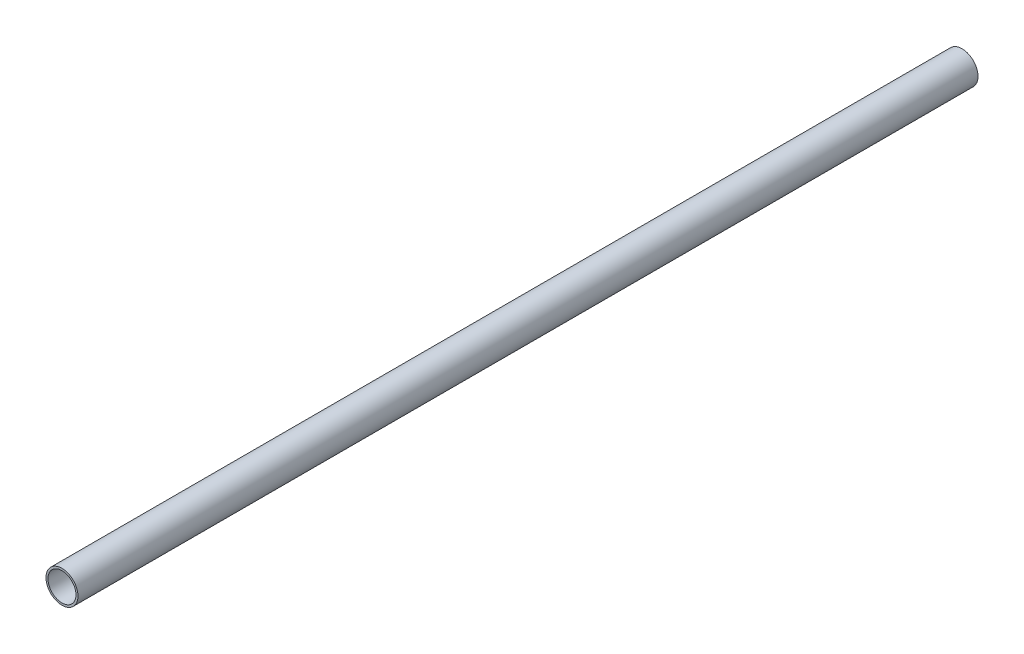
ISO-10303-21;
HEADER;
FILE_DESCRIPTION(('STEP AP214'),'2;1');
FILE_NAME('part.step','',(''),(''),'','','');
FILE_SCHEMA(('AUTOMOTIVE_DESIGN { 1 0 10303 214 1 1 1 1 }'));
ENDSEC;
DATA;
#1=APPLICATION_CONTEXT('core data for automotive mechanical design processes');
#2=APPLICATION_PROTOCOL_DEFINITION('international standard','automotive_design',2000,#1);
#3=PRODUCT_CONTEXT('',#1,'mechanical');
#4=PRODUCT('Part','Part','',(#3));
#5=PRODUCT_RELATED_PRODUCT_CATEGORY('part','',(#4));
#6=PRODUCT_DEFINITION_FORMATION('','',#4);
#7=PRODUCT_DEFINITION_CONTEXT('part definition',#1,'design');
#8=PRODUCT_DEFINITION('design','',#6,#7);
#9=PRODUCT_DEFINITION_SHAPE('','',#8);
#10=(LENGTH_UNIT() NAMED_UNIT(*) SI_UNIT(.MILLI.,.METRE.));
#11=(NAMED_UNIT(*) PLANE_ANGLE_UNIT() SI_UNIT($,.RADIAN.));
#12=(NAMED_UNIT(*) SI_UNIT($,.STERADIAN.) SOLID_ANGLE_UNIT());
#13=UNCERTAINTY_MEASURE_WITH_UNIT(LENGTH_MEASURE(1.E-05),#10,'distance_accuracy_value','');
#14=(GEOMETRIC_REPRESENTATION_CONTEXT(3) GLOBAL_UNCERTAINTY_ASSIGNED_CONTEXT((#13)) GLOBAL_UNIT_ASSIGNED_CONTEXT((#10,
#11,#12)) REPRESENTATION_CONTEXT('',''));
#15=CARTESIAN_POINT('',(0.,0.,0.));
#16=DIRECTION('',(0.,0.,1.));
#17=DIRECTION('',(1.,0.,0.));
#18=AXIS2_PLACEMENT_3D('',#15,#16,#17);
#19=CARTESIAN_POINT('',(0.,0.,450.));
#20=DIRECTION('',(0.,0.,1.));
#21=DIRECTION('',(1.,0.,0.));
#22=AXIS2_PLACEMENT_3D('',#19,#20,#21);
#23=PLANE('',#22);
#24=CARTESIAN_POINT('',(0.,0.,450.));
#25=DIRECTION('',(0.,0.,1.));
#26=DIRECTION('',(1.,0.,0.));
#27=AXIS2_PLACEMENT_3D('',#24,#25,#26);
#28=CIRCLE('',#27,8.);
#29=CARTESIAN_POINT('',(8.,0.,450.));
#30=VERTEX_POINT('',#29);
#31=EDGE_CURVE('E11',#30,#30,#28,.T.);
#32=ORIENTED_EDGE('',*,*,#31,.T.);
#33=EDGE_LOOP('',(#32));
#34=FACE_BOUND('',#33,.T.);
#35=CARTESIAN_POINT('',(0.,0.,450.));
#36=DIRECTION('',(0.,0.,1.));
#37=DIRECTION('',(1.,0.,0.));
#38=AXIS2_PLACEMENT_3D('',#35,#36,#37);
#39=CIRCLE('',#38,7.);
#40=CARTESIAN_POINT('',(7.,0.,450.));
#41=VERTEX_POINT('',#40);
#42=EDGE_CURVE('E48',#41,#41,#39,.T.);
#43=ORIENTED_EDGE('',*,*,#42,.F.);
#44=EDGE_LOOP('',(#43));
#45=FACE_BOUND('',#44,.T.);
#46=ADVANCED_FACE('F37',(#34,#45),#23,.T.);
#47=CARTESIAN_POINT('',(0.,0.,0.));
#48=DIRECTION('',(0.,0.,1.));
#49=DIRECTION('',(1.,0.,0.));
#50=AXIS2_PLACEMENT_3D('',#47,#48,#49);
#51=PLANE('',#50);
#52=CARTESIAN_POINT('',(0.,0.,0.));
#53=DIRECTION('',(0.,0.,1.));
#54=DIRECTION('',(1.,0.,0.));
#55=AXIS2_PLACEMENT_3D('',#52,#53,#54);
#56=CIRCLE('',#55,8.);
#57=CARTESIAN_POINT('',(8.,0.,0.));
#58=VERTEX_POINT('',#57);
#59=EDGE_CURVE('E41',#58,#58,#56,.T.);
#60=ORIENTED_EDGE('',*,*,#59,.F.);
#61=EDGE_LOOP('',(#60));
#62=FACE_BOUND('',#61,.T.);
#63=CARTESIAN_POINT('',(0.,0.,0.));
#64=DIRECTION('',(0.,0.,1.));
#65=DIRECTION('',(1.,0.,0.));
#66=AXIS2_PLACEMENT_3D('',#63,#64,#65);
#67=CIRCLE('',#66,7.);
#68=CARTESIAN_POINT('',(7.,0.,0.));
#69=VERTEX_POINT('',#68);
#70=EDGE_CURVE('E50',#69,#69,#67,.T.);
#71=ORIENTED_EDGE('',*,*,#70,.T.);
#72=EDGE_LOOP('',(#71));
#73=FACE_BOUND('',#72,.T.);
#74=ADVANCED_FACE('F60',(#62,#73),#51,.F.);
#75=CARTESIAN_POINT('',(0.,0.,450.));
#76=DIRECTION('',(0.,0.,-1.));
#77=DIRECTION('',(-1.,0.,0.));
#78=AXIS2_PLACEMENT_3D('',#75,#76,#77);
#79=CYLINDRICAL_SURFACE('',#78,8.);
#80=ORIENTED_EDGE('',*,*,#31,.F.);
#81=EDGE_LOOP('',(#80));
#82=FACE_BOUND('',#81,.T.);
#83=ORIENTED_EDGE('',*,*,#59,.T.);
#84=EDGE_LOOP('',(#83));
#85=FACE_BOUND('',#84,.T.);
#86=ADVANCED_FACE('F39',(#82,#85),#79,.T.);
#87=CARTESIAN_POINT('',(0.,0.,450.));
#88=DIRECTION('',(0.,0.,-1.));
#89=DIRECTION('',(-1.,0.,0.));
#90=AXIS2_PLACEMENT_3D('',#87,#88,#89);
#91=CYLINDRICAL_SURFACE('',#90,7.);
#92=ORIENTED_EDGE('',*,*,#42,.T.);
#93=EDGE_LOOP('',(#92));
#94=FACE_BOUND('',#93,.T.);
#95=ORIENTED_EDGE('',*,*,#70,.F.);
#96=EDGE_LOOP('',(#95));
#97=FACE_BOUND('',#96,.T.);
#98=ADVANCED_FACE('F56',(#94,#97),#91,.F.);
#99=CLOSED_SHELL('',(#46,#74,#86,#98));
#100=MANIFOLD_SOLID_BREP('B2',#99);
#101=ADVANCED_BREP_SHAPE_REPRESENTATION('',(#18,#100),#14);
#102=SHAPE_DEFINITION_REPRESENTATION(#9,#101);
ENDSEC;
END-ISO-10303-21;
